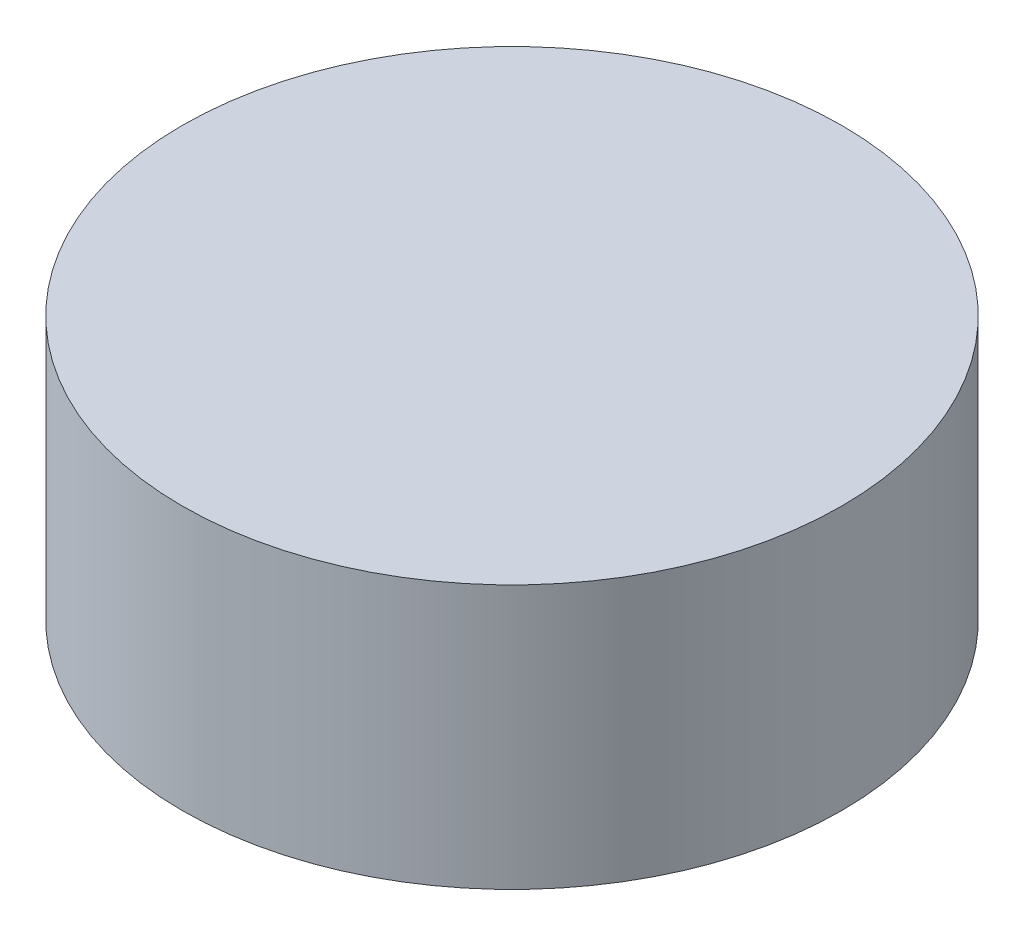
ISO-10303-21;
HEADER;
FILE_DESCRIPTION(('STEP AP214'),'2;1');
FILE_NAME('part.step','',(''),(''),'','','');
FILE_SCHEMA(('AUTOMOTIVE_DESIGN { 1 0 10303 214 1 1 1 1 }'));
ENDSEC;
DATA;
#1=APPLICATION_CONTEXT('core data for automotive mechanical design processes');
#2=APPLICATION_PROTOCOL_DEFINITION('international standard','automotive_design',2000,#1);
#3=PRODUCT_CONTEXT('',#1,'mechanical');
#4=PRODUCT('Part','Part','',(#3));
#5=PRODUCT_RELATED_PRODUCT_CATEGORY('part','',(#4));
#6=PRODUCT_DEFINITION_FORMATION('','',#4);
#7=PRODUCT_DEFINITION_CONTEXT('part definition',#1,'design');
#8=PRODUCT_DEFINITION('design','',#6,#7);
#9=PRODUCT_DEFINITION_SHAPE('','',#8);
#10=(LENGTH_UNIT() NAMED_UNIT(*) SI_UNIT(.MILLI.,.METRE.));
#11=(NAMED_UNIT(*) PLANE_ANGLE_UNIT() SI_UNIT($,.RADIAN.));
#12=(NAMED_UNIT(*) SI_UNIT($,.STERADIAN.) SOLID_ANGLE_UNIT());
#13=UNCERTAINTY_MEASURE_WITH_UNIT(LENGTH_MEASURE(1.E-05),#10,'distance_accuracy_value','');
#14=(GEOMETRIC_REPRESENTATION_CONTEXT(3) GLOBAL_UNCERTAINTY_ASSIGNED_CONTEXT((#13)) GLOBAL_UNIT_ASSIGNED_CONTEXT((#10,
#11,#12)) REPRESENTATION_CONTEXT('',''));
#15=CARTESIAN_POINT('',(0.,0.,0.));
#16=DIRECTION('',(0.,0.,1.));
#17=DIRECTION('',(1.,0.,0.));
#18=AXIS2_PLACEMENT_3D('',#15,#16,#17);
#19=CARTESIAN_POINT('',(0.,3.,0.));
#20=DIRECTION('',(0.,-1.,0.));
#21=DIRECTION('',(0.,0.,-1.));
#22=AXIS2_PLACEMENT_3D('',#19,#20,#21);
#23=CYLINDRICAL_SURFACE('',#22,3.75);
#24=CARTESIAN_POINT('',(0.,3.,0.));
#25=DIRECTION('',(0.,1.,0.));
#26=DIRECTION('',(0.,0.,1.));
#27=AXIS2_PLACEMENT_3D('',#24,#25,#26);
#28=CIRCLE('',#27,3.75);
#29=CARTESIAN_POINT('',(0.,3.,3.75));
#30=VERTEX_POINT('',#29);
#31=EDGE_CURVE('E10',#30,#30,#28,.T.);
#32=ORIENTED_EDGE('',*,*,#31,.F.);
#33=EDGE_LOOP('',(#32));
#34=FACE_BOUND('',#33,.T.);
#35=CARTESIAN_POINT('',(0.,0.,0.));
#36=DIRECTION('',(0.,1.,0.));
#37=DIRECTION('',(0.,0.,1.));
#38=AXIS2_PLACEMENT_3D('',#35,#36,#37);
#39=CIRCLE('',#38,3.75);
#40=CARTESIAN_POINT('',(0.,0.,3.75));
#41=VERTEX_POINT('',#40);
#42=EDGE_CURVE('E34',#41,#41,#39,.T.);
#43=ORIENTED_EDGE('',*,*,#42,.T.);
#44=EDGE_LOOP('',(#43));
#45=FACE_BOUND('',#44,.T.);
#46=ADVANCED_FACE('F31',(#34,#45),#23,.T.);
#47=CARTESIAN_POINT('',(0.,3.,0.));
#48=DIRECTION('',(0.,1.,0.));
#49=DIRECTION('',(0.,0.,1.));
#50=AXIS2_PLACEMENT_3D('',#47,#48,#49);
#51=PLANE('',#50);
#52=ORIENTED_EDGE('',*,*,#31,.T.);
#53=EDGE_LOOP('',(#52));
#54=FACE_BOUND('',#53,.T.);
#55=ADVANCED_FACE('F46',(#54),#51,.T.);
#56=CARTESIAN_POINT('',(0.,0.,0.));
#57=DIRECTION('',(0.,1.,0.));
#58=DIRECTION('',(0.,0.,1.));
#59=AXIS2_PLACEMENT_3D('',#56,#57,#58);
#60=PLANE('',#59);
#61=ORIENTED_EDGE('',*,*,#42,.F.);
#62=EDGE_LOOP('',(#61));
#63=FACE_BOUND('',#62,.T.);
#64=ADVANCED_FACE('F44',(#63),#60,.F.);
#65=CLOSED_SHELL('',(#46,#55,#64));
#66=MANIFOLD_SOLID_BREP('B2',#65);
#67=ADVANCED_BREP_SHAPE_REPRESENTATION('',(#18,#66),#14);
#68=SHAPE_DEFINITION_REPRESENTATION(#9,#67);
ENDSEC;
END-ISO-10303-21;
